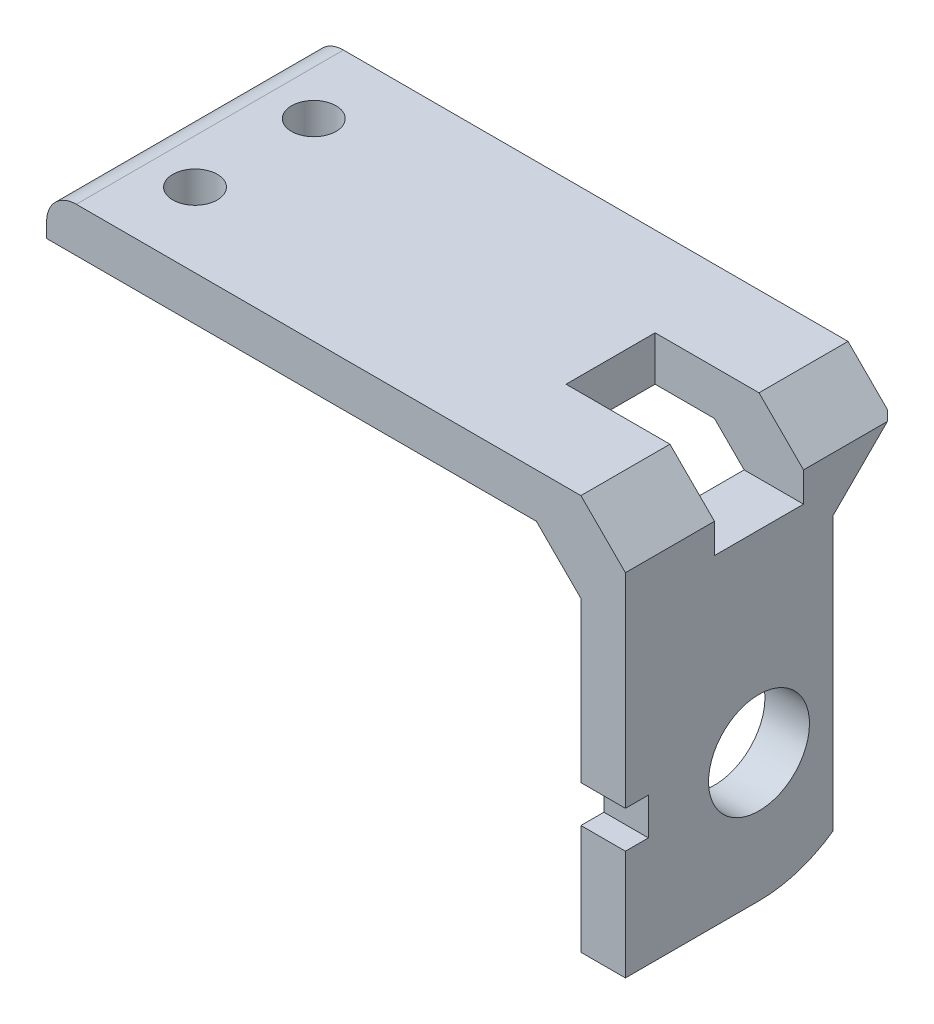
ISO-10303-21;
HEADER;
FILE_DESCRIPTION(('STEP AP214'),'2;1');
FILE_NAME('part.step','',(''),(''),'','','');
FILE_SCHEMA(('AUTOMOTIVE_DESIGN { 1 0 10303 214 1 1 1 1 }'));
ENDSEC;
DATA;
#1=APPLICATION_CONTEXT('core data for automotive mechanical design processes');
#2=APPLICATION_PROTOCOL_DEFINITION('international standard','automotive_design',2000,#1);
#3=PRODUCT_CONTEXT('',#1,'mechanical');
#4=PRODUCT('Part','Part','',(#3));
#5=PRODUCT_RELATED_PRODUCT_CATEGORY('part','',(#4));
#6=PRODUCT_DEFINITION_FORMATION('','',#4);
#7=PRODUCT_DEFINITION_CONTEXT('part definition',#1,'design');
#8=PRODUCT_DEFINITION('design','',#6,#7);
#9=PRODUCT_DEFINITION_SHAPE('','',#8);
#10=(LENGTH_UNIT() NAMED_UNIT(*) SI_UNIT(.MILLI.,.METRE.));
#11=(NAMED_UNIT(*) PLANE_ANGLE_UNIT() SI_UNIT($,.RADIAN.));
#12=(NAMED_UNIT(*) SI_UNIT($,.STERADIAN.) SOLID_ANGLE_UNIT());
#13=UNCERTAINTY_MEASURE_WITH_UNIT(LENGTH_MEASURE(1.E-05),#10,'distance_accuracy_value','');
#14=(GEOMETRIC_REPRESENTATION_CONTEXT(3) GLOBAL_UNCERTAINTY_ASSIGNED_CONTEXT((#13)) GLOBAL_UNIT_ASSIGNED_CONTEXT((#10,
#11,#12)) REPRESENTATION_CONTEXT('',''));
#15=CARTESIAN_POINT('',(0.,0.,0.));
#16=DIRECTION('',(0.,0.,1.));
#17=DIRECTION('',(1.,0.,0.));
#18=AXIS2_PLACEMENT_3D('',#15,#16,#17);
#19=CARTESIAN_POINT('',(0.,23.6498516320475,18.));
#20=DIRECTION('',(-0.707106781186548,-0.707106781186547,0.));
#21=DIRECTION('',(0.,0.,-1.));
#22=AXIS2_PLACEMENT_3D('',#19,#20,#21);
#23=PLANE('',#22);
#24=DIRECTION('',(0.707106781186547,-0.707106781186548,0.));
#25=VECTOR('',#24,1.);
#26=CARTESIAN_POINT('',(0.,23.6498516320475,6.));
#27=LINE('',#26,#25);
#28=CARTESIAN_POINT('',(3.00000000000001,20.6498516320475,6.));
#29=VERTEX_POINT('',#28);
#30=CARTESIAN_POINT('',(0.,23.6498516320475,6.));
#31=VERTEX_POINT('',#30);
#32=EDGE_CURVE('E255',#29,#31,#27,.F.);
#33=ORIENTED_EDGE('',*,*,#32,.F.);
#34=DIRECTION('',(0.,0.,1.));
#35=VECTOR('',#34,1.);
#36=CARTESIAN_POINT('',(3.,20.6498516320475,18.));
#37=LINE('',#36,#35);
#38=CARTESIAN_POINT('',(3.,20.6498516320475,0.350000000000048));
#39=VERTEX_POINT('',#38);
#40=EDGE_CURVE('E406',#39,#29,#37,.T.);
#41=ORIENTED_EDGE('',*,*,#40,.F.);
#42=DIRECTION('',(-0.577350269189627,0.577350269189628,-0.577350269189622));
#43=VECTOR('',#42,1.);
#44=CARTESIAN_POINT('',(6.88333333333327,16.7665182987142,4.2333333333333));
#45=LINE('',#44,#43);
#46=CARTESIAN_POINT('',(2.64999999999995,20.9998516320475,0.));
#47=VERTEX_POINT('',#46);
#48=EDGE_CURVE('E403',#47,#39,#45,.F.);
#49=ORIENTED_EDGE('',*,*,#48,.F.);
#50=DIRECTION('',(-0.707106781186547,0.707106781186548,0.));
#51=VECTOR('',#50,1.);
#52=CARTESIAN_POINT('',(0.,23.6498516320475,0.));
#53=LINE('',#52,#51);
#54=CARTESIAN_POINT('',(0.,23.6498516320475,0.));
#55=VERTEX_POINT('',#54);
#56=EDGE_CURVE('E401',#55,#47,#53,.F.);
#57=ORIENTED_EDGE('',*,*,#56,.F.);
#58=DIRECTION('',(0.,0.,-1.));
#59=VECTOR('',#58,1.);
#60=CARTESIAN_POINT('',(0.,23.6498516320475,18.));
#61=LINE('',#60,#59);
#62=EDGE_CURVE('E389',#31,#55,#61,.T.);
#63=ORIENTED_EDGE('',*,*,#62,.F.);
#64=EDGE_LOOP('',(#33,#41,#49,#57,#63));
#65=FACE_BOUND('',#64,.T.);
#66=ADVANCED_FACE('F39',(#65),#23,.F.);
#67=CARTESIAN_POINT('',(-34.,21.6498516320475,18.));
#68=DIRECTION('',(0.,0.,1.));
#69=DIRECTION('',(1.,0.,0.));
#70=AXIS2_PLACEMENT_3D('',#67,#68,#69);
#71=PLANE('',#70);
#72=DIRECTION('',(0.,1.,0.));
#73=VECTOR('',#72,1.);
#74=CARTESIAN_POINT('',(3.,23.6498516320475,18.));
#75=LINE('',#74,#73);
#76=CARTESIAN_POINT('',(3.,6.89985163204748,18.));
#77=VERTEX_POINT('',#76);
#78=CARTESIAN_POINT('',(3.,20.6498516320475,18.));
#79=VERTEX_POINT('',#78);
#80=EDGE_CURVE('E345',#77,#79,#75,.T.);
#81=ORIENTED_EDGE('',*,*,#80,.T.);
#82=DIRECTION('',(0.707106781186547,-0.707106781186548,0.));
#83=VECTOR('',#82,1.);
#84=CARTESIAN_POINT('',(-16.,39.6498516320475,18.));
#85=LINE('',#84,#83);
#86=CARTESIAN_POINT('',(0.,23.6498516320475,18.));
#87=VERTEX_POINT('',#86);
#88=EDGE_CURVE('E408',#79,#87,#85,.F.);
#89=ORIENTED_EDGE('',*,*,#88,.T.);
#90=DIRECTION('',(-1.,0.,0.));
#91=VECTOR('',#90,1.);
#92=CARTESIAN_POINT('',(-34.,23.6498516320475,18.));
#93=LINE('',#92,#91);
#94=CARTESIAN_POINT('',(-34.,23.6498516320475,18.));
#95=VERTEX_POINT('',#94);
#96=EDGE_CURVE('E350',#87,#95,#93,.T.);
#97=ORIENTED_EDGE('',*,*,#96,.T.);
#98=CARTESIAN_POINT('',(-34.,21.6498516320475,18.));
#99=DIRECTION('',(0.,0.,1.));
#100=DIRECTION('',(1.,0.,0.));
#101=AXIS2_PLACEMENT_3D('',#98,#99,#100);
#102=CIRCLE('',#101,2.);
#103=CARTESIAN_POINT('',(-36.,21.6498516320475,18.));
#104=VERTEX_POINT('',#103);
#105=EDGE_CURVE('E352',#95,#104,#102,.T.);
#106=ORIENTED_EDGE('',*,*,#105,.T.);
#107=DIRECTION('',(0.,-1.,0.));
#108=VECTOR('',#107,1.);
#109=CARTESIAN_POINT('',(-36.,20.6498516320475,18.));
#110=LINE('',#109,#108);
#111=CARTESIAN_POINT('',(-36.,20.6498516320475,18.));
#112=VERTEX_POINT('',#111);
#113=EDGE_CURVE('E354',#104,#112,#110,.T.);
#114=ORIENTED_EDGE('',*,*,#113,.T.);
#115=DIRECTION('',(1.,0.,0.));
#116=VECTOR('',#115,1.);
#117=CARTESIAN_POINT('',(0.,20.6498516320475,18.));
#118=LINE('',#117,#116);
#119=CARTESIAN_POINT('',(-2.99999999999999,20.6498516320475,18.));
#120=VERTEX_POINT('',#119);
#121=EDGE_CURVE('E357',#112,#120,#118,.T.);
#122=ORIENTED_EDGE('',*,*,#121,.T.);
#123=DIRECTION('',(-0.707106781186543,0.707106781186552,0.));
#124=VECTOR('',#123,1.);
#125=CARTESIAN_POINT('',(0.,17.6498516320475,18.));
#126=LINE('',#125,#124);
#127=CARTESIAN_POINT('',(0.,17.6498516320475,18.));
#128=VERTEX_POINT('',#127);
#129=EDGE_CURVE('E425',#120,#128,#126,.F.);
#130=ORIENTED_EDGE('',*,*,#129,.T.);
#131=DIRECTION('',(0.,-1.,0.));
#132=VECTOR('',#131,1.);
#133=CARTESIAN_POINT('',(0.,-6.35014836795252,18.));
#134=LINE('',#133,#132);
#135=CARTESIAN_POINT('',(0.,6.89985163204748,18.));
#136=VERTEX_POINT('',#135);
#137=EDGE_CURVE('E362',#128,#136,#134,.T.);
#138=ORIENTED_EDGE('',*,*,#137,.T.);
#139=DIRECTION('',(-1.,0.,0.));
#140=VECTOR('',#139,1.);
#141=CARTESIAN_POINT('',(3.,6.89985163204748,18.));
#142=LINE('',#141,#140);
#143=EDGE_CURVE('E282',#77,#136,#142,.T.);
#144=ORIENTED_EDGE('',*,*,#143,.F.);
#145=EDGE_LOOP('',(#81,#89,#97,#106,#114,#122,#130,#138,#144));
#146=FACE_BOUND('',#145,.T.);
#147=ADVANCED_FACE('F454',(#146),#71,.T.);
#148=CARTESIAN_POINT('',(3.,23.6498516320475,18.));
#149=DIRECTION('',(-1.,0.,0.));
#150=DIRECTION('',(0.,-1.,0.));
#151=AXIS2_PLACEMENT_3D('',#148,#149,#150);
#152=PLANE('',#151);
#153=ORIENTED_EDGE('',*,*,#40,.T.);
#154=DIRECTION('',(0.,1.,0.));
#155=VECTOR('',#154,1.);
#156=CARTESIAN_POINT('',(3.00000000000001,18.6498516320475,6.));
#157=LINE('',#156,#155);
#158=CARTESIAN_POINT('',(3.00000000000001,18.6498516320475,6.));
#159=VERTEX_POINT('',#158);
#160=EDGE_CURVE('E225',#159,#29,#157,.T.);
#161=ORIENTED_EDGE('',*,*,#160,.F.);
#162=DIRECTION('',(0.,0.,-1.));
#163=VECTOR('',#162,1.);
#164=CARTESIAN_POINT('',(3.00000000000001,18.6498516320475,6.));
#165=LINE('',#164,#163);
#166=CARTESIAN_POINT('',(3.00000000000001,18.6498516320475,12.));
#167=VERTEX_POINT('',#166);
#168=EDGE_CURVE('E213',#167,#159,#165,.T.);
#169=ORIENTED_EDGE('',*,*,#168,.F.);
#170=DIRECTION('',(0.,1.,0.));
#171=VECTOR('',#170,1.);
#172=CARTESIAN_POINT('',(3.00000000000001,18.6498516320475,12.));
#173=LINE('',#172,#171);
#174=CARTESIAN_POINT('',(3.00000000000001,20.6498516320475,12.));
#175=VERTEX_POINT('',#174);
#176=EDGE_CURVE('E220',#167,#175,#173,.T.);
#177=ORIENTED_EDGE('',*,*,#176,.T.);
#178=EDGE_CURVE('E405',#175,#79,#37,.T.);
#179=ORIENTED_EDGE('',*,*,#178,.T.);
#180=ORIENTED_EDGE('',*,*,#80,.F.);
#181=DIRECTION('',(0.,0.,-1.));
#182=VECTOR('',#181,1.);
#183=CARTESIAN_POINT('',(3.,6.89985163204748,16.45));
#184=LINE('',#183,#182);
#185=CARTESIAN_POINT('',(3.,6.89985163204748,16.45));
#186=VERTEX_POINT('',#185);
#187=EDGE_CURVE('E265',#77,#186,#184,.T.);
#188=ORIENTED_EDGE('',*,*,#187,.T.);
#189=DIRECTION('',(0.,-1.,0.));
#190=VECTOR('',#189,1.);
#191=CARTESIAN_POINT('',(3.,6.89985163204748,16.45));
#192=LINE('',#191,#190);
#193=CARTESIAN_POINT('',(3.,4.39985163204748,16.45));
#194=VERTEX_POINT('',#193);
#195=EDGE_CURVE('E258',#186,#194,#192,.T.);
#196=ORIENTED_EDGE('',*,*,#195,.T.);
#197=DIRECTION('',(0.,0.,1.));
#198=VECTOR('',#197,1.);
#199=CARTESIAN_POINT('',(3.,4.39985163204748,16.45));
#200=LINE('',#199,#198);
#201=CARTESIAN_POINT('',(3.,4.39985163204748,18.));
#202=VERTEX_POINT('',#201);
#203=EDGE_CURVE('E261',#194,#202,#200,.T.);
#204=ORIENTED_EDGE('',*,*,#203,.T.);
#205=CARTESIAN_POINT('',(3.,-3.00014836795252,18.));
#206=VERTEX_POINT('',#205);
#207=EDGE_CURVE('E348',#206,#202,#75,.T.);
#208=ORIENTED_EDGE('',*,*,#207,.F.);
#209=DIRECTION('',(0.,0.,-1.));
#210=VECTOR('',#209,1.);
#211=CARTESIAN_POINT('',(3.,-3.00014836795252,9.));
#212=LINE('',#211,#210);
#213=CARTESIAN_POINT('',(3.,-3.00014836795252,8.99999999999999));
#214=VERTEX_POINT('',#213);
#215=EDGE_CURVE('E291',#206,#214,#212,.T.);
#216=ORIENTED_EDGE('',*,*,#215,.T.);
#217=CARTESIAN_POINT('',(3.,5.64985163204748,8.99999999999999));
#218=DIRECTION('',(1.,0.,0.));
#219=DIRECTION('',(0.,-1.,0.));
#220=AXIS2_PLACEMENT_3D('',#217,#218,#219);
#221=CIRCLE('',#220,8.65);
#222=CARTESIAN_POINT('',(3.,-1.40865387549448,4.));
#223=VERTEX_POINT('',#222);
#224=EDGE_CURVE('E294',#214,#223,#221,.T.);
#225=ORIENTED_EDGE('',*,*,#224,.T.);
#226=DIRECTION('',(0.,1.,0.));
#227=VECTOR('',#226,1.);
#228=CARTESIAN_POINT('',(3.,16.9998516320475,4.));
#229=LINE('',#228,#227);
#230=CARTESIAN_POINT('',(3.,16.9998516320475,4.));
#231=VERTEX_POINT('',#230);
#232=EDGE_CURVE('E298',#223,#231,#229,.T.);
#233=ORIENTED_EDGE('',*,*,#232,.T.);
#234=DIRECTION('',(0.,0.707106781186551,-0.707106781186544));
#235=VECTOR('',#234,1.);
#236=CARTESIAN_POINT('',(3.,20.9998516320475,0.));
#237=LINE('',#236,#235);
#238=EDGE_CURVE('E301',#231,#39,#237,.T.);
#239=ORIENTED_EDGE('',*,*,#238,.T.);
#240=EDGE_LOOP('',(#153,#161,#169,#177,#179,#180,#188,#196,#204,#208,#216,#225,#233,#239));
#241=FACE_BOUND('',#240,.T.);
#242=CARTESIAN_POINT('',(3.,5.64985163204748,9.));
#243=DIRECTION('',(1.,0.,0.));
#244=DIRECTION('',(0.,1.,0.));
#245=AXIS2_PLACEMENT_3D('',#242,#243,#244);
#246=CIRCLE('',#245,3.4);
#247=CARTESIAN_POINT('',(3.,9.04985163204748,9.));
#248=VERTEX_POINT('',#247);
#249=EDGE_CURVE('E340',#248,#248,#246,.T.);
#250=ORIENTED_EDGE('',*,*,#249,.F.);
#251=EDGE_LOOP('',(#250));
#252=FACE_BOUND('',#251,.T.);
#253=ADVANCED_FACE('F230',(#241,#252),#152,.F.);
#254=CARTESIAN_POINT('',(-34.,23.6498516320475,18.));
#255=DIRECTION('',(0.,-1.,0.));
#256=DIRECTION('',(1.,0.,0.));
#257=AXIS2_PLACEMENT_3D('',#254,#255,#256);
#258=PLANE('',#257);
#259=CARTESIAN_POINT('',(-31.,23.6498516320475,5.));
#260=DIRECTION('',(0.,1.,0.));
#261=DIRECTION('',(-1.,0.,0.));
#262=AXIS2_PLACEMENT_3D('',#259,#260,#261);
#263=CIRCLE('',#262,1.5);
#264=CARTESIAN_POINT('',(-32.5,23.6498516320475,5.));
#265=VERTEX_POINT('',#264);
#266=EDGE_CURVE('E332',#265,#265,#263,.T.);
#267=ORIENTED_EDGE('',*,*,#266,.F.);
#268=EDGE_LOOP('',(#267));
#269=FACE_BOUND('',#268,.T.);
#270=CARTESIAN_POINT('',(-31.,23.6498516320475,13.));
#271=DIRECTION('',(0.,1.,0.));
#272=DIRECTION('',(1.,0.,0.));
#273=AXIS2_PLACEMENT_3D('',#270,#271,#272);
#274=CIRCLE('',#273,1.5);
#275=CARTESIAN_POINT('',(-29.5,23.6498516320475,13.));
#276=VERTEX_POINT('',#275);
#277=EDGE_CURVE('E331',#276,#276,#274,.T.);
#278=ORIENTED_EDGE('',*,*,#277,.F.);
#279=EDGE_LOOP('',(#278));
#280=FACE_BOUND('',#279,.T.);
#281=DIRECTION('',(0.,0.,1.));
#282=VECTOR('',#281,1.);
#283=CARTESIAN_POINT('',(-6.99999999999999,23.6498516320475,6.));
#284=LINE('',#283,#282);
#285=CARTESIAN_POINT('',(-6.99999999999999,23.6498516320475,6.));
#286=VERTEX_POINT('',#285);
#287=CARTESIAN_POINT('',(-6.99999999999999,23.6498516320475,12.));
#288=VERTEX_POINT('',#287);
#289=EDGE_CURVE('E236',#286,#288,#284,.T.);
#290=ORIENTED_EDGE('',*,*,#289,.F.);
#291=DIRECTION('',(-1.,0.,0.));
#292=VECTOR('',#291,1.);
#293=CARTESIAN_POINT('',(-6.99999999999999,23.6498516320475,6.));
#294=LINE('',#293,#292);
#295=EDGE_CURVE('E217',#31,#286,#294,.T.);
#296=ORIENTED_EDGE('',*,*,#295,.F.);
#297=ORIENTED_EDGE('',*,*,#62,.T.);
#298=DIRECTION('',(-1.,0.,0.));
#299=VECTOR('',#298,1.);
#300=CARTESIAN_POINT('',(-34.,23.6498516320475,0.));
#301=LINE('',#300,#299);
#302=CARTESIAN_POINT('',(-34.,23.6498516320475,0.));
#303=VERTEX_POINT('',#302);
#304=EDGE_CURVE('E366',#55,#303,#301,.T.);
#305=ORIENTED_EDGE('',*,*,#304,.T.);
#306=DIRECTION('',(0.,0.,-1.));
#307=VECTOR('',#306,1.);
#308=CARTESIAN_POINT('',(-34.,23.6498516320475,18.));
#309=LINE('',#308,#307);
#310=EDGE_CURVE('E385',#95,#303,#309,.T.);
#311=ORIENTED_EDGE('',*,*,#310,.F.);
#312=ORIENTED_EDGE('',*,*,#96,.F.);
#313=CARTESIAN_POINT('',(0.,23.6498516320475,12.));
#314=VERTEX_POINT('',#313);
#315=EDGE_CURVE('E398',#87,#314,#61,.T.);
#316=ORIENTED_EDGE('',*,*,#315,.T.);
#317=DIRECTION('',(1.,0.,0.));
#318=VECTOR('',#317,1.);
#319=CARTESIAN_POINT('',(-6.99999999999999,23.6498516320475,12.));
#320=LINE('',#319,#318);
#321=EDGE_CURVE('E55',#288,#314,#320,.T.);
#322=ORIENTED_EDGE('',*,*,#321,.F.);
#323=EDGE_LOOP('',(#290,#296,#297,#305,#311,#312,#316,#322));
#324=FACE_BOUND('',#323,.T.);
#325=ADVANCED_FACE('F466',(#269,#280,#324),#258,.F.);
#326=CARTESIAN_POINT('',(-34.,21.6498516320475,18.));
#327=DIRECTION('',(0.,0.,-1.));
#328=DIRECTION('',(-1.,0.,0.));
#329=AXIS2_PLACEMENT_3D('',#326,#327,#328);
#330=CYLINDRICAL_SURFACE('',#329,2.);
#331=CARTESIAN_POINT('',(-34.,21.6498516320475,0.));
#332=DIRECTION('',(0.,0.,1.));
#333=DIRECTION('',(1.,0.,0.));
#334=AXIS2_PLACEMENT_3D('',#331,#332,#333);
#335=CIRCLE('',#334,2.);
#336=CARTESIAN_POINT('',(-36.,21.6498516320475,0.));
#337=VERTEX_POINT('',#336);
#338=EDGE_CURVE('E369',#303,#337,#335,.T.);
#339=ORIENTED_EDGE('',*,*,#338,.T.);
#340=DIRECTION('',(0.,0.,-1.));
#341=VECTOR('',#340,1.);
#342=CARTESIAN_POINT('',(-36.,21.6498516320475,18.));
#343=LINE('',#342,#341);
#344=EDGE_CURVE('E381',#104,#337,#343,.T.);
#345=ORIENTED_EDGE('',*,*,#344,.F.);
#346=ORIENTED_EDGE('',*,*,#105,.F.);
#347=ORIENTED_EDGE('',*,*,#310,.T.);
#348=EDGE_LOOP('',(#339,#345,#346,#347));
#349=FACE_BOUND('',#348,.T.);
#350=ADVANCED_FACE('F473',(#349),#330,.T.);
#351=CARTESIAN_POINT('',(-36.,20.6498516320475,18.));
#352=DIRECTION('',(1.,0.,0.));
#353=DIRECTION('',(0.,0.,-1.));
#354=AXIS2_PLACEMENT_3D('',#351,#352,#353);
#355=PLANE('',#354);
#356=DIRECTION('',(0.,-1.,0.));
#357=VECTOR('',#356,1.);
#358=CARTESIAN_POINT('',(-36.,20.6498516320475,0.));
#359=LINE('',#358,#357);
#360=CARTESIAN_POINT('',(-36.,20.6498516320475,0.));
#361=VERTEX_POINT('',#360);
#362=EDGE_CURVE('E372',#337,#361,#359,.T.);
#363=ORIENTED_EDGE('',*,*,#362,.T.);
#364=DIRECTION('',(0.,0.,-1.));
#365=VECTOR('',#364,1.);
#366=CARTESIAN_POINT('',(-36.,20.6498516320475,18.));
#367=LINE('',#366,#365);
#368=EDGE_CURVE('E365',#112,#361,#367,.T.);
#369=ORIENTED_EDGE('',*,*,#368,.F.);
#370=ORIENTED_EDGE('',*,*,#113,.F.);
#371=ORIENTED_EDGE('',*,*,#344,.T.);
#372=EDGE_LOOP('',(#363,#369,#370,#371));
#373=FACE_BOUND('',#372,.T.);
#374=ADVANCED_FACE('F477',(#373),#355,.F.);
#375=CARTESIAN_POINT('',(0.,20.6498516320475,18.));
#376=DIRECTION('',(0.,1.,0.));
#377=DIRECTION('',(-1.,0.,0.));
#378=AXIS2_PLACEMENT_3D('',#375,#376,#377);
#379=PLANE('',#378);
#380=CARTESIAN_POINT('',(-31.,20.6498516320475,5.));
#381=DIRECTION('',(0.,1.,0.));
#382=DIRECTION('',(-1.,0.,0.));
#383=AXIS2_PLACEMENT_3D('',#380,#381,#382);
#384=CIRCLE('',#383,1.5);
#385=CARTESIAN_POINT('',(-32.5,20.6498516320475,5.));
#386=VERTEX_POINT('',#385);
#387=EDGE_CURVE('E344',#386,#386,#384,.T.);
#388=ORIENTED_EDGE('',*,*,#387,.T.);
#389=EDGE_LOOP('',(#388));
#390=FACE_BOUND('',#389,.T.);
#391=CARTESIAN_POINT('',(-31.,20.6498516320475,13.));
#392=DIRECTION('',(0.,1.,0.));
#393=DIRECTION('',(-1.,0.,0.));
#394=AXIS2_PLACEMENT_3D('',#391,#392,#393);
#395=CIRCLE('',#394,1.5);
#396=CARTESIAN_POINT('',(-32.5,20.6498516320475,13.));
#397=VERTEX_POINT('',#396);
#398=EDGE_CURVE('E336',#397,#397,#395,.T.);
#399=ORIENTED_EDGE('',*,*,#398,.T.);
#400=EDGE_LOOP('',(#399));
#401=FACE_BOUND('',#400,.T.);
#402=DIRECTION('',(0.,0.,1.));
#403=VECTOR('',#402,1.);
#404=CARTESIAN_POINT('',(-2.99999999999999,20.6498516320475,18.));
#405=LINE('',#404,#403);
#406=CARTESIAN_POINT('',(-2.99999999999999,20.6498516320475,0.35000000000003));
#407=VERTEX_POINT('',#406);
#408=CARTESIAN_POINT('',(-2.99999999999999,20.6498516320475,6.));
#409=VERTEX_POINT('',#408);
#410=EDGE_CURVE('E414',#407,#409,#405,.T.);
#411=ORIENTED_EDGE('',*,*,#410,.T.);
#412=DIRECTION('',(-1.,0.,0.));
#413=VECTOR('',#412,1.);
#414=CARTESIAN_POINT('',(0.,20.6498516320475,6.));
#415=LINE('',#414,#413);
#416=CARTESIAN_POINT('',(-6.99999999999999,20.6498516320475,6.));
#417=VERTEX_POINT('',#416);
#418=EDGE_CURVE('E251',#409,#417,#415,.T.);
#419=ORIENTED_EDGE('',*,*,#418,.T.);
#420=DIRECTION('',(0.,0.,1.));
#421=VECTOR('',#420,1.);
#422=CARTESIAN_POINT('',(-6.99999999999999,20.6498516320475,18.));
#423=LINE('',#422,#421);
#424=CARTESIAN_POINT('',(-6.99999999999999,20.6498516320475,12.));
#425=VERTEX_POINT('',#424);
#426=EDGE_CURVE('E12',#417,#425,#423,.T.);
#427=ORIENTED_EDGE('',*,*,#426,.T.);
#428=DIRECTION('',(1.,0.,0.));
#429=VECTOR('',#428,1.);
#430=CARTESIAN_POINT('',(0.,20.6498516320475,12.));
#431=LINE('',#430,#429);
#432=CARTESIAN_POINT('',(-2.99999999999999,20.6498516320475,12.));
#433=VERTEX_POINT('',#432);
#434=EDGE_CURVE('E245',#425,#433,#431,.T.);
#435=ORIENTED_EDGE('',*,*,#434,.T.);
#436=EDGE_CURVE('E413',#433,#120,#405,.T.);
#437=ORIENTED_EDGE('',*,*,#436,.T.);
#438=ORIENTED_EDGE('',*,*,#121,.F.);
#439=ORIENTED_EDGE('',*,*,#368,.T.);
#440=DIRECTION('',(1.,0.,0.));
#441=VECTOR('',#440,1.);
#442=CARTESIAN_POINT('',(0.,20.6498516320475,0.));
#443=LINE('',#442,#441);
#444=CARTESIAN_POINT('',(0.,20.6498516320475,0.));
#445=VERTEX_POINT('',#444);
#446=EDGE_CURVE('E349',#361,#445,#443,.T.);
#447=ORIENTED_EDGE('',*,*,#446,.T.);
#448=DIRECTION('',(0.,0.,1.));
#449=VECTOR('',#448,1.);
#450=CARTESIAN_POINT('',(0.,20.6498516320475,18.));
#451=LINE('',#450,#449);
#452=CARTESIAN_POINT('',(0.,20.6498516320475,0.350000000000031));
#453=VERTEX_POINT('',#452);
#454=EDGE_CURVE('E321',#445,#453,#451,.T.);
#455=ORIENTED_EDGE('',*,*,#454,.T.);
#456=DIRECTION('',(-1.,0.,0.));
#457=VECTOR('',#456,1.);
#458=CARTESIAN_POINT('',(3.,20.6498516320475,0.350000000000031));
#459=LINE('',#458,#457);
#460=EDGE_CURVE('E418',#453,#407,#459,.T.);
#461=ORIENTED_EDGE('',*,*,#460,.T.);
#462=EDGE_LOOP('',(#411,#419,#427,#435,#437,#438,#439,#447,#455,#461));
#463=FACE_BOUND('',#462,.T.);
#464=ADVANCED_FACE('F436',(#390,#401,#463),#379,.F.);
#465=CARTESIAN_POINT('',(0.,-6.35014836795252,18.));
#466=DIRECTION('',(1.,0.,0.));
#467=DIRECTION('',(0.,1.,0.));
#468=AXIS2_PLACEMENT_3D('',#465,#466,#467);
#469=PLANE('',#468);
#470=CARTESIAN_POINT('',(0.,5.64985163204748,9.));
#471=DIRECTION('',(1.,0.,0.));
#472=DIRECTION('',(0.,1.,0.));
#473=AXIS2_PLACEMENT_3D('',#470,#471,#472);
#474=CIRCLE('',#473,3.4);
#475=CARTESIAN_POINT('',(0.,9.04985163204748,9.));
#476=VERTEX_POINT('',#475);
#477=EDGE_CURVE('E343',#476,#476,#474,.T.);
#478=ORIENTED_EDGE('',*,*,#477,.T.);
#479=EDGE_LOOP('',(#478));
#480=FACE_BOUND('',#479,.T.);
#481=ORIENTED_EDGE('',*,*,#137,.F.);
#482=DIRECTION('',(0.,0.,-1.));
#483=VECTOR('',#482,1.);
#484=CARTESIAN_POINT('',(0.,17.6498516320475,0.350000000000031));
#485=LINE('',#484,#483);
#486=CARTESIAN_POINT('',(0.,17.6498516320475,3.35000000000002));
#487=VERTEX_POINT('',#486);
#488=EDGE_CURVE('E410',#128,#487,#485,.T.);
#489=ORIENTED_EDGE('',*,*,#488,.T.);
#490=DIRECTION('',(0.,0.707106781186551,-0.707106781186544));
#491=VECTOR('',#490,1.);
#492=CARTESIAN_POINT('',(0.,20.9998516320475,0.));
#493=LINE('',#492,#491);
#494=CARTESIAN_POINT('',(0.,16.9998516320475,4.));
#495=VERTEX_POINT('',#494);
#496=EDGE_CURVE('E295',#495,#487,#493,.T.);
#497=ORIENTED_EDGE('',*,*,#496,.F.);
#498=DIRECTION('',(0.,1.,0.));
#499=VECTOR('',#498,1.);
#500=CARTESIAN_POINT('',(0.,16.9998516320475,4.));
#501=LINE('',#500,#499);
#502=CARTESIAN_POINT('',(0.,-1.40865387549448,4.));
#503=VERTEX_POINT('',#502);
#504=EDGE_CURVE('E313',#503,#495,#501,.T.);
#505=ORIENTED_EDGE('',*,*,#504,.F.);
#506=CARTESIAN_POINT('',(0.,5.64985163204748,8.99999999999999));
#507=DIRECTION('',(1.,0.,0.));
#508=DIRECTION('',(0.,-1.,0.));
#509=AXIS2_PLACEMENT_3D('',#506,#507,#508);
#510=CIRCLE('',#509,8.65);
#511=CARTESIAN_POINT('',(0.,-3.00014836795252,8.99999999999999));
#512=VERTEX_POINT('',#511);
#513=EDGE_CURVE('E310',#512,#503,#510,.T.);
#514=ORIENTED_EDGE('',*,*,#513,.F.);
#515=DIRECTION('',(0.,0.,-1.));
#516=VECTOR('',#515,1.);
#517=CARTESIAN_POINT('',(0.,-3.00014836795252,9.));
#518=LINE('',#517,#516);
#519=CARTESIAN_POINT('',(0.,-3.00014836795252,18.));
#520=VERTEX_POINT('',#519);
#521=EDGE_CURVE('E307',#520,#512,#518,.T.);
#522=ORIENTED_EDGE('',*,*,#521,.F.);
#523=CARTESIAN_POINT('',(0.,4.39985163204748,18.));
#524=VERTEX_POINT('',#523);
#525=EDGE_CURVE('E361',#524,#520,#134,.T.);
#526=ORIENTED_EDGE('',*,*,#525,.F.);
#527=DIRECTION('',(0.,0.,1.));
#528=VECTOR('',#527,1.);
#529=CARTESIAN_POINT('',(0.,4.39985163204748,16.45));
#530=LINE('',#529,#528);
#531=CARTESIAN_POINT('',(0.,4.39985163204748,16.45));
#532=VERTEX_POINT('',#531);
#533=EDGE_CURVE('E272',#532,#524,#530,.T.);
#534=ORIENTED_EDGE('',*,*,#533,.F.);
#535=DIRECTION('',(0.,-1.,0.));
#536=VECTOR('',#535,1.);
#537=CARTESIAN_POINT('',(0.,6.89985163204748,16.45));
#538=LINE('',#537,#536);
#539=CARTESIAN_POINT('',(0.,6.89985163204748,16.45));
#540=VERTEX_POINT('',#539);
#541=EDGE_CURVE('E257',#540,#532,#538,.T.);
#542=ORIENTED_EDGE('',*,*,#541,.F.);
#543=DIRECTION('',(0.,0.,-1.));
#544=VECTOR('',#543,1.);
#545=CARTESIAN_POINT('',(0.,6.89985163204748,16.45));
#546=LINE('',#545,#544);
#547=EDGE_CURVE('E262',#136,#540,#546,.T.);
#548=ORIENTED_EDGE('',*,*,#547,.F.);
#549=EDGE_LOOP('',(#481,#489,#497,#505,#514,#522,#526,#534,#542,#548));
#550=FACE_BOUND('',#549,.T.);
#551=ADVANCED_FACE('F448',(#480,#550),#469,.F.);
#552=DIRECTION('',(-1.,0.,0.));
#553=VECTOR('',#552,1.);
#554=CARTESIAN_POINT('',(3.,4.39985163204748,18.));
#555=LINE('',#554,#553);
#556=EDGE_CURVE('E286',#202,#524,#555,.T.);
#557=ORIENTED_EDGE('',*,*,#556,.T.);
#558=ORIENTED_EDGE('',*,*,#525,.T.);
#559=DIRECTION('',(-1.,0.,0.));
#560=VECTOR('',#559,1.);
#561=CARTESIAN_POINT('',(3.,-3.00014836795252,18.));
#562=LINE('',#561,#560);
#563=EDGE_CURVE('E304',#206,#520,#562,.T.);
#564=ORIENTED_EDGE('',*,*,#563,.F.);
#565=ORIENTED_EDGE('',*,*,#207,.T.);
#566=EDGE_LOOP('',(#557,#558,#564,#565));
#567=FACE_BOUND('',#566,.T.);
#568=ADVANCED_FACE('F516',(#567),#71,.T.);
#569=CARTESIAN_POINT('',(-34.,21.6498516320475,0.));
#570=DIRECTION('',(0.,0.,1.));
#571=DIRECTION('',(1.,0.,0.));
#572=AXIS2_PLACEMENT_3D('',#569,#570,#571);
#573=PLANE('',#572);
#574=ORIENTED_EDGE('',*,*,#304,.F.);
#575=ORIENTED_EDGE('',*,*,#56,.T.);
#576=DIRECTION('',(-1.,0.,0.));
#577=VECTOR('',#576,1.);
#578=CARTESIAN_POINT('',(3.,20.9998516320475,0.));
#579=LINE('',#578,#577);
#580=CARTESIAN_POINT('',(0.,20.9998516320475,0.));
#581=VERTEX_POINT('',#580);
#582=EDGE_CURVE('E319',#47,#581,#579,.T.);
#583=ORIENTED_EDGE('',*,*,#582,.T.);
#584=DIRECTION('',(0.,-1.,0.));
#585=VECTOR('',#584,1.);
#586=CARTESIAN_POINT('',(0.,-6.35014836795252,0.));
#587=LINE('',#586,#585);
#588=EDGE_CURVE('E281',#581,#445,#587,.T.);
#589=ORIENTED_EDGE('',*,*,#588,.T.);
#590=ORIENTED_EDGE('',*,*,#446,.F.);
#591=ORIENTED_EDGE('',*,*,#362,.F.);
#592=ORIENTED_EDGE('',*,*,#338,.F.);
#593=EDGE_LOOP('',(#574,#575,#583,#589,#590,#591,#592));
#594=FACE_BOUND('',#593,.T.);
#595=ADVANCED_FACE('F495',(#594),#573,.F.);
#596=CARTESIAN_POINT('',(-19.,5.64985163204748,9.));
#597=DIRECTION('',(1.,0.,0.));
#598=DIRECTION('',(0.,1.,0.));
#599=AXIS2_PLACEMENT_3D('',#596,#597,#598);
#600=CYLINDRICAL_SURFACE('',#599,3.4);
#601=ORIENTED_EDGE('',*,*,#249,.T.);
#602=EDGE_LOOP('',(#601));
#603=FACE_BOUND('',#602,.T.);
#604=ORIENTED_EDGE('',*,*,#477,.F.);
#605=EDGE_LOOP('',(#604));
#606=FACE_BOUND('',#605,.T.);
#607=ADVANCED_FACE('F565',(#603,#606),#600,.F.);
#608=CARTESIAN_POINT('',(-31.,1.64985163204748,13.));
#609=DIRECTION('',(0.,1.,0.));
#610=DIRECTION('',(-1.,0.,0.));
#611=AXIS2_PLACEMENT_3D('',#608,#609,#610);
#612=CYLINDRICAL_SURFACE('',#611,1.5);
#613=ORIENTED_EDGE('',*,*,#277,.T.);
#614=EDGE_LOOP('',(#613));
#615=FACE_BOUND('',#614,.T.);
#616=ORIENTED_EDGE('',*,*,#398,.F.);
#617=EDGE_LOOP('',(#616));
#618=FACE_BOUND('',#617,.T.);
#619=ADVANCED_FACE('F507',(#615,#618),#612,.F.);
#620=CARTESIAN_POINT('',(-31.,1.64985163204748,5.));
#621=DIRECTION('',(0.,1.,0.));
#622=DIRECTION('',(-1.,0.,0.));
#623=AXIS2_PLACEMENT_3D('',#620,#621,#622);
#624=CYLINDRICAL_SURFACE('',#623,1.5);
#625=ORIENTED_EDGE('',*,*,#266,.T.);
#626=EDGE_LOOP('',(#625));
#627=FACE_BOUND('',#626,.T.);
#628=ORIENTED_EDGE('',*,*,#387,.F.);
#629=EDGE_LOOP('',(#628));
#630=FACE_BOUND('',#629,.T.);
#631=ADVANCED_FACE('F499',(#627,#630),#624,.F.);
#632=CARTESIAN_POINT('',(0.,5.64985163204748,8.99999999999999));
#633=DIRECTION('',(-1.,0.,0.));
#634=DIRECTION('',(0.,-1.,0.));
#635=AXIS2_PLACEMENT_3D('',#632,#633,#634);
#636=PLANE('',#635);
#637=ORIENTED_EDGE('',*,*,#588,.F.);
#638=EDGE_CURVE('E316',#453,#581,#493,.T.);
#639=ORIENTED_EDGE('',*,*,#638,.F.);
#640=ORIENTED_EDGE('',*,*,#454,.F.);
#641=EDGE_LOOP('',(#637,#639,#640));
#642=FACE_BOUND('',#641,.T.);
#643=ADVANCED_FACE('F497',(#642),#636,.F.);
#644=CARTESIAN_POINT('',(3.,20.9998516320475,0.));
#645=DIRECTION('',(0.,0.707106781186544,0.707106781186551));
#646=DIRECTION('',(0.,-0.707106781186551,0.707106781186544));
#647=AXIS2_PLACEMENT_3D('',#644,#645,#646);
#648=PLANE('',#647);
#649=ORIENTED_EDGE('',*,*,#582,.F.);
#650=ORIENTED_EDGE('',*,*,#48,.T.);
#651=ORIENTED_EDGE('',*,*,#238,.F.);
#652=DIRECTION('',(-1.,0.,0.));
#653=VECTOR('',#652,1.);
#654=CARTESIAN_POINT('',(3.,16.9998516320475,4.));
#655=LINE('',#654,#653);
#656=EDGE_CURVE('E322',#231,#495,#655,.T.);
#657=ORIENTED_EDGE('',*,*,#656,.T.);
#658=ORIENTED_EDGE('',*,*,#496,.T.);
#659=DIRECTION('',(0.577350269189623,-0.57735026918963,0.577350269189624));
#660=VECTOR('',#659,1.);
#661=CARTESIAN_POINT('',(-1.23333333333336,18.8831849653808,2.11666666666666));
#662=LINE('',#661,#660);
#663=EDGE_CURVE('E422',#487,#407,#662,.F.);
#664=ORIENTED_EDGE('',*,*,#663,.T.);
#665=ORIENTED_EDGE('',*,*,#460,.F.);
#666=ORIENTED_EDGE('',*,*,#638,.T.);
#667=EDGE_LOOP('',(#649,#650,#651,#657,#658,#664,#665,#666));
#668=FACE_BOUND('',#667,.T.);
#669=ADVANCED_FACE('F441',(#668),#648,.F.);
#670=CARTESIAN_POINT('',(3.,16.9998516320475,4.));
#671=DIRECTION('',(0.,0.,1.));
#672=DIRECTION('',(0.,-1.,0.));
#673=AXIS2_PLACEMENT_3D('',#670,#671,#672);
#674=PLANE('',#673);
#675=ORIENTED_EDGE('',*,*,#504,.T.);
#676=ORIENTED_EDGE('',*,*,#656,.F.);
#677=ORIENTED_EDGE('',*,*,#232,.F.);
#678=DIRECTION('',(-1.,0.,0.));
#679=VECTOR('',#678,1.);
#680=CARTESIAN_POINT('',(3.,-1.40865387549448,4.));
#681=LINE('',#680,#679);
#682=EDGE_CURVE('E324',#223,#503,#681,.T.);
#683=ORIENTED_EDGE('',*,*,#682,.T.);
#684=EDGE_LOOP('',(#675,#676,#677,#683));
#685=FACE_BOUND('',#684,.T.);
#686=ADVANCED_FACE('F505',(#685),#674,.F.);
#687=CARTESIAN_POINT('',(3.,5.64985163204748,8.99999999999999));
#688=DIRECTION('',(-1.,0.,0.));
#689=DIRECTION('',(0.,-1.,0.));
#690=AXIS2_PLACEMENT_3D('',#687,#688,#689);
#691=CYLINDRICAL_SURFACE('',#690,8.65);
#692=ORIENTED_EDGE('',*,*,#513,.T.);
#693=ORIENTED_EDGE('',*,*,#682,.F.);
#694=ORIENTED_EDGE('',*,*,#224,.F.);
#695=DIRECTION('',(-1.,0.,0.));
#696=VECTOR('',#695,1.);
#697=CARTESIAN_POINT('',(3.,-3.00014836795252,8.99999999999999));
#698=LINE('',#697,#696);
#699=EDGE_CURVE('E326',#214,#512,#698,.T.);
#700=ORIENTED_EDGE('',*,*,#699,.T.);
#701=EDGE_LOOP('',(#692,#693,#694,#700));
#702=FACE_BOUND('',#701,.T.);
#703=ADVANCED_FACE('F538',(#702),#691,.T.);
#704=CARTESIAN_POINT('',(3.,-3.00014836795252,9.));
#705=DIRECTION('',(0.,1.,0.));
#706=DIRECTION('',(0.,0.,1.));
#707=AXIS2_PLACEMENT_3D('',#704,#705,#706);
#708=PLANE('',#707);
#709=ORIENTED_EDGE('',*,*,#521,.T.);
#710=ORIENTED_EDGE('',*,*,#699,.F.);
#711=ORIENTED_EDGE('',*,*,#215,.F.);
#712=ORIENTED_EDGE('',*,*,#563,.T.);
#713=EDGE_LOOP('',(#709,#710,#711,#712));
#714=FACE_BOUND('',#713,.T.);
#715=ADVANCED_FACE('F533',(#714),#708,.F.);
#716=CARTESIAN_POINT('',(3.,6.89985163204748,16.45));
#717=DIRECTION('',(0.,0.,-1.));
#718=DIRECTION('',(-1.,0.,0.));
#719=AXIS2_PLACEMENT_3D('',#716,#717,#718);
#720=PLANE('',#719);
#721=ORIENTED_EDGE('',*,*,#541,.T.);
#722=DIRECTION('',(-1.,0.,0.));
#723=VECTOR('',#722,1.);
#724=CARTESIAN_POINT('',(3.,4.39985163204748,16.45));
#725=LINE('',#724,#723);
#726=EDGE_CURVE('E268',#194,#532,#725,.T.);
#727=ORIENTED_EDGE('',*,*,#726,.F.);
#728=ORIENTED_EDGE('',*,*,#195,.F.);
#729=DIRECTION('',(-1.,0.,0.));
#730=VECTOR('',#729,1.);
#731=CARTESIAN_POINT('',(3.,6.89985163204748,16.45));
#732=LINE('',#731,#730);
#733=EDGE_CURVE('E278',#186,#540,#732,.T.);
#734=ORIENTED_EDGE('',*,*,#733,.T.);
#735=EDGE_LOOP('',(#721,#727,#728,#734));
#736=FACE_BOUND('',#735,.T.);
#737=ADVANCED_FACE('F529',(#736),#720,.F.);
#738=CARTESIAN_POINT('',(3.,6.89985163204748,16.45));
#739=DIRECTION('',(0.,1.,0.));
#740=DIRECTION('',(-1.,0.,0.));
#741=AXIS2_PLACEMENT_3D('',#738,#739,#740);
#742=PLANE('',#741);
#743=ORIENTED_EDGE('',*,*,#547,.T.);
#744=ORIENTED_EDGE('',*,*,#733,.F.);
#745=ORIENTED_EDGE('',*,*,#187,.F.);
#746=ORIENTED_EDGE('',*,*,#143,.T.);
#747=EDGE_LOOP('',(#743,#744,#745,#746));
#748=FACE_BOUND('',#747,.T.);
#749=ADVANCED_FACE('F457',(#748),#742,.F.);
#750=CARTESIAN_POINT('',(3.,4.39985163204748,16.45));
#751=DIRECTION('',(0.,-1.,0.));
#752=DIRECTION('',(1.,0.,0.));
#753=AXIS2_PLACEMENT_3D('',#750,#751,#752);
#754=PLANE('',#753);
#755=ORIENTED_EDGE('',*,*,#533,.T.);
#756=ORIENTED_EDGE('',*,*,#556,.F.);
#757=ORIENTED_EDGE('',*,*,#203,.F.);
#758=ORIENTED_EDGE('',*,*,#726,.T.);
#759=EDGE_LOOP('',(#755,#756,#757,#758));
#760=FACE_BOUND('',#759,.T.);
#761=ADVANCED_FACE('F519',(#760),#754,.F.);
#762=DIRECTION('',(-0.707106781186547,0.707106781186548,0.));
#763=VECTOR('',#762,1.);
#764=CARTESIAN_POINT('',(0.,23.6498516320475,12.));
#765=LINE('',#764,#763);
#766=EDGE_CURVE('E222',#314,#175,#765,.F.);
#767=ORIENTED_EDGE('',*,*,#766,.F.);
#768=ORIENTED_EDGE('',*,*,#315,.F.);
#769=ORIENTED_EDGE('',*,*,#88,.F.);
#770=ORIENTED_EDGE('',*,*,#178,.F.);
#771=EDGE_LOOP('',(#767,#768,#769,#770));
#772=FACE_BOUND('',#771,.T.);
#773=ADVANCED_FACE('F463',(#772),#23,.F.);
#774=CARTESIAN_POINT('',(0.,17.6498516320475,18.));
#775=DIRECTION('',(-0.707106781186552,-0.707106781186543,0.));
#776=DIRECTION('',(0.,0.,1.));
#777=AXIS2_PLACEMENT_3D('',#774,#775,#776);
#778=PLANE('',#777);
#779=DIRECTION('',(0.,0.,-1.));
#780=VECTOR('',#779,1.);
#781=CARTESIAN_POINT('',(-1.,18.6498516320475,18.));
#782=LINE('',#781,#780);
#783=CARTESIAN_POINT('',(-1.,18.6498516320475,6.));
#784=VERTEX_POINT('',#783);
#785=CARTESIAN_POINT('',(-1.,18.6498516320475,12.));
#786=VERTEX_POINT('',#785);
#787=EDGE_CURVE('E215',#784,#786,#782,.F.);
#788=ORIENTED_EDGE('',*,*,#787,.F.);
#789=DIRECTION('',(0.707106781186543,-0.707106781186552,0.));
#790=VECTOR('',#789,1.);
#791=CARTESIAN_POINT('',(0.,17.6498516320475,6.));
#792=LINE('',#791,#790);
#793=EDGE_CURVE('E48',#784,#409,#792,.F.);
#794=ORIENTED_EDGE('',*,*,#793,.T.);
#795=ORIENTED_EDGE('',*,*,#410,.F.);
#796=ORIENTED_EDGE('',*,*,#663,.F.);
#797=ORIENTED_EDGE('',*,*,#488,.F.);
#798=ORIENTED_EDGE('',*,*,#129,.F.);
#799=ORIENTED_EDGE('',*,*,#436,.F.);
#800=DIRECTION('',(-0.707106781186543,0.707106781186552,0.));
#801=VECTOR('',#800,1.);
#802=CARTESIAN_POINT('',(0.,17.6498516320475,12.));
#803=LINE('',#802,#801);
#804=EDGE_CURVE('E429',#433,#786,#803,.F.);
#805=ORIENTED_EDGE('',*,*,#804,.T.);
#806=EDGE_LOOP('',(#788,#794,#795,#796,#797,#798,#799,#805));
#807=FACE_BOUND('',#806,.T.);
#808=ADVANCED_FACE('F41',(#807),#778,.T.);
#809=CARTESIAN_POINT('',(-6.99999999999999,18.6498516320475,6.));
#810=DIRECTION('',(-1.,0.,0.));
#811=DIRECTION('',(0.,0.,1.));
#812=AXIS2_PLACEMENT_3D('',#809,#810,#811);
#813=PLANE('',#812);
#814=DIRECTION('',(0.,1.,0.));
#815=VECTOR('',#814,1.);
#816=CARTESIAN_POINT('',(-6.99999999999999,18.6498516320475,6.));
#817=LINE('',#816,#815);
#818=EDGE_CURVE('E242',#417,#286,#817,.T.);
#819=ORIENTED_EDGE('',*,*,#818,.T.);
#820=ORIENTED_EDGE('',*,*,#289,.T.);
#821=DIRECTION('',(0.,1.,0.));
#822=VECTOR('',#821,1.);
#823=CARTESIAN_POINT('',(-6.99999999999999,18.6498516320475,12.));
#824=LINE('',#823,#822);
#825=EDGE_CURVE('E226',#425,#288,#824,.T.);
#826=ORIENTED_EDGE('',*,*,#825,.F.);
#827=ORIENTED_EDGE('',*,*,#426,.F.);
#828=EDGE_LOOP('',(#819,#820,#826,#827));
#829=FACE_BOUND('',#828,.T.);
#830=ADVANCED_FACE('F484',(#829),#813,.F.);
#831=CARTESIAN_POINT('',(-6.99999999999999,18.6498516320475,6.));
#832=DIRECTION('',(0.,0.,-1.));
#833=DIRECTION('',(-1.,0.,0.));
#834=AXIS2_PLACEMENT_3D('',#831,#832,#833);
#835=PLANE('',#834);
#836=ORIENTED_EDGE('',*,*,#32,.T.);
#837=ORIENTED_EDGE('',*,*,#295,.T.);
#838=ORIENTED_EDGE('',*,*,#818,.F.);
#839=ORIENTED_EDGE('',*,*,#418,.F.);
#840=ORIENTED_EDGE('',*,*,#793,.F.);
#841=DIRECTION('',(-1.,0.,0.));
#842=VECTOR('',#841,1.);
#843=CARTESIAN_POINT('',(-6.99999999999999,18.6498516320475,6.));
#844=LINE('',#843,#842);
#845=EDGE_CURVE('E66',#159,#784,#844,.T.);
#846=ORIENTED_EDGE('',*,*,#845,.F.);
#847=ORIENTED_EDGE('',*,*,#160,.T.);
#848=EDGE_LOOP('',(#836,#837,#838,#839,#840,#846,#847));
#849=FACE_BOUND('',#848,.T.);
#850=ADVANCED_FACE('F485',(#849),#835,.F.);
#851=CARTESIAN_POINT('',(-6.99999999999999,18.6498516320475,12.));
#852=DIRECTION('',(0.,0.,1.));
#853=DIRECTION('',(1.,0.,0.));
#854=AXIS2_PLACEMENT_3D('',#851,#852,#853);
#855=PLANE('',#854);
#856=ORIENTED_EDGE('',*,*,#766,.T.);
#857=ORIENTED_EDGE('',*,*,#176,.F.);
#858=DIRECTION('',(1.,0.,0.));
#859=VECTOR('',#858,1.);
#860=CARTESIAN_POINT('',(-6.99999999999999,18.6498516320475,12.));
#861=LINE('',#860,#859);
#862=EDGE_CURVE('E209',#786,#167,#861,.T.);
#863=ORIENTED_EDGE('',*,*,#862,.F.);
#864=ORIENTED_EDGE('',*,*,#804,.F.);
#865=ORIENTED_EDGE('',*,*,#434,.F.);
#866=ORIENTED_EDGE('',*,*,#825,.T.);
#867=ORIENTED_EDGE('',*,*,#321,.T.);
#868=EDGE_LOOP('',(#856,#857,#863,#864,#865,#866,#867));
#869=FACE_BOUND('',#868,.T.);
#870=ADVANCED_FACE('F221',(#869),#855,.F.);
#871=CARTESIAN_POINT('',(0.,18.6498516320475,0.));
#872=DIRECTION('',(0.,1.,0.));
#873=DIRECTION('',(0.,0.,1.));
#874=AXIS2_PLACEMENT_3D('',#871,#872,#873);
#875=PLANE('',#874);
#876=ORIENTED_EDGE('',*,*,#787,.T.);
#877=ORIENTED_EDGE('',*,*,#862,.T.);
#878=ORIENTED_EDGE('',*,*,#168,.T.);
#879=ORIENTED_EDGE('',*,*,#845,.T.);
#880=EDGE_LOOP('',(#876,#877,#878,#879));
#881=FACE_BOUND('',#880,.T.);
#882=ADVANCED_FACE('F211',(#881),#875,.T.);
#883=CLOSED_SHELL('',(#66,#147,#253,#325,#350,#374,#464,#551,#568,#595,#607,#619,#631,#643,#669,
#686,#703,#715,#737,#749,#761,#773,#808,#830,#850,#870,#882));
#884=MANIFOLD_SOLID_BREP('B2',#883);
#885=ADVANCED_BREP_SHAPE_REPRESENTATION('',(#18,#884),#14);
#886=SHAPE_DEFINITION_REPRESENTATION(#9,#885);
ENDSEC;
END-ISO-10303-21;
